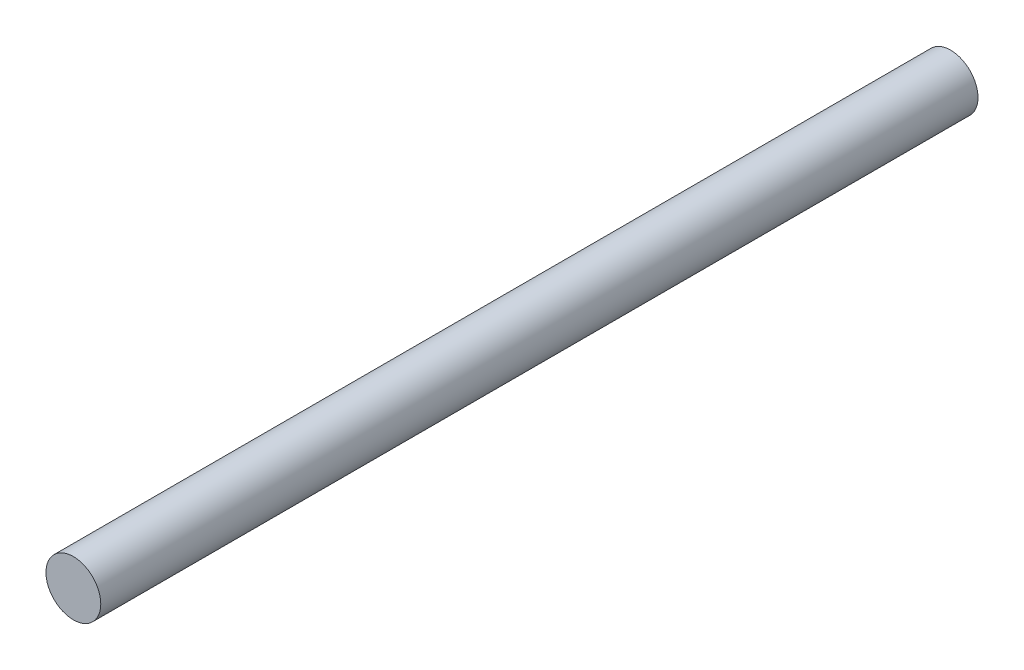
ISO-10303-21;
HEADER;
FILE_DESCRIPTION(('STEP AP214'),'2;1');
FILE_NAME('part.step','',(''),(''),'','','');
FILE_SCHEMA(('AUTOMOTIVE_DESIGN { 1 0 10303 214 1 1 1 1 }'));
ENDSEC;
DATA;
#1=APPLICATION_CONTEXT('core data for automotive mechanical design processes');
#2=APPLICATION_PROTOCOL_DEFINITION('international standard','automotive_design',2000,#1);
#3=PRODUCT_CONTEXT('',#1,'mechanical');
#4=PRODUCT('Part','Part','',(#3));
#5=PRODUCT_RELATED_PRODUCT_CATEGORY('part','',(#4));
#6=PRODUCT_DEFINITION_FORMATION('','',#4);
#7=PRODUCT_DEFINITION_CONTEXT('part definition',#1,'design');
#8=PRODUCT_DEFINITION('design','',#6,#7);
#9=PRODUCT_DEFINITION_SHAPE('','',#8);
#10=(LENGTH_UNIT() NAMED_UNIT(*) SI_UNIT(.MILLI.,.METRE.));
#11=(NAMED_UNIT(*) PLANE_ANGLE_UNIT() SI_UNIT($,.RADIAN.));
#12=(NAMED_UNIT(*) SI_UNIT($,.STERADIAN.) SOLID_ANGLE_UNIT());
#13=UNCERTAINTY_MEASURE_WITH_UNIT(LENGTH_MEASURE(1.E-05),#10,'distance_accuracy_value','');
#14=(GEOMETRIC_REPRESENTATION_CONTEXT(3) GLOBAL_UNCERTAINTY_ASSIGNED_CONTEXT((#13)) GLOBAL_UNIT_ASSIGNED_CONTEXT((#10,
#11,#12)) REPRESENTATION_CONTEXT('',''));
#15=CARTESIAN_POINT('',(0.,0.,0.));
#16=DIRECTION('',(0.,0.,1.));
#17=DIRECTION('',(1.,0.,0.));
#18=AXIS2_PLACEMENT_3D('',#15,#16,#17);
#19=CARTESIAN_POINT('',(0.,0.,400.));
#20=DIRECTION('',(0.,0.,-1.));
#21=DIRECTION('',(-1.,0.,0.));
#22=AXIS2_PLACEMENT_3D('',#19,#20,#21);
#23=CYLINDRICAL_SURFACE('',#22,12.5);
#24=CARTESIAN_POINT('',(0.,0.,400.));
#25=DIRECTION('',(0.,0.,1.));
#26=DIRECTION('',(1.,0.,0.));
#27=AXIS2_PLACEMENT_3D('',#24,#25,#26);
#28=CIRCLE('',#27,12.5);
#29=CARTESIAN_POINT('',(12.5,0.,400.));
#30=VERTEX_POINT('',#29);
#31=EDGE_CURVE('E10',#30,#30,#28,.T.);
#32=ORIENTED_EDGE('',*,*,#31,.F.);
#33=EDGE_LOOP('',(#32));
#34=FACE_BOUND('',#33,.T.);
#35=CARTESIAN_POINT('',(0.,0.,0.));
#36=DIRECTION('',(0.,0.,1.));
#37=DIRECTION('',(1.,0.,0.));
#38=AXIS2_PLACEMENT_3D('',#35,#36,#37);
#39=CIRCLE('',#38,12.5);
#40=CARTESIAN_POINT('',(12.5,0.,0.));
#41=VERTEX_POINT('',#40);
#42=EDGE_CURVE('E40',#41,#41,#39,.T.);
#43=ORIENTED_EDGE('',*,*,#42,.T.);
#44=EDGE_LOOP('',(#43));
#45=FACE_BOUND('',#44,.T.);
#46=ADVANCED_FACE('F37',(#34,#45),#23,.T.);
#47=CARTESIAN_POINT('',(0.,0.,400.));
#48=DIRECTION('',(0.,0.,1.));
#49=DIRECTION('',(1.,0.,0.));
#50=AXIS2_PLACEMENT_3D('',#47,#48,#49);
#51=PLANE('',#50);
#52=ORIENTED_EDGE('',*,*,#31,.T.);
#53=EDGE_LOOP('',(#52));
#54=FACE_BOUND('',#53,.T.);
#55=ADVANCED_FACE('F54',(#54),#51,.T.);
#56=CARTESIAN_POINT('',(0.,0.,0.));
#57=DIRECTION('',(0.,0.,1.));
#58=DIRECTION('',(1.,0.,0.));
#59=AXIS2_PLACEMENT_3D('',#56,#57,#58);
#60=PLANE('',#59);
#61=ORIENTED_EDGE('',*,*,#42,.F.);
#62=EDGE_LOOP('',(#61));
#63=FACE_BOUND('',#62,.T.);
#64=ADVANCED_FACE('F52',(#63),#60,.F.);
#65=CLOSED_SHELL('',(#46,#55,#64));
#66=MANIFOLD_SOLID_BREP('B2',#65);
#67=ADVANCED_BREP_SHAPE_REPRESENTATION('',(#18,#66),#14);
#68=SHAPE_DEFINITION_REPRESENTATION(#9,#67);
ENDSEC;
END-ISO-10303-21;
